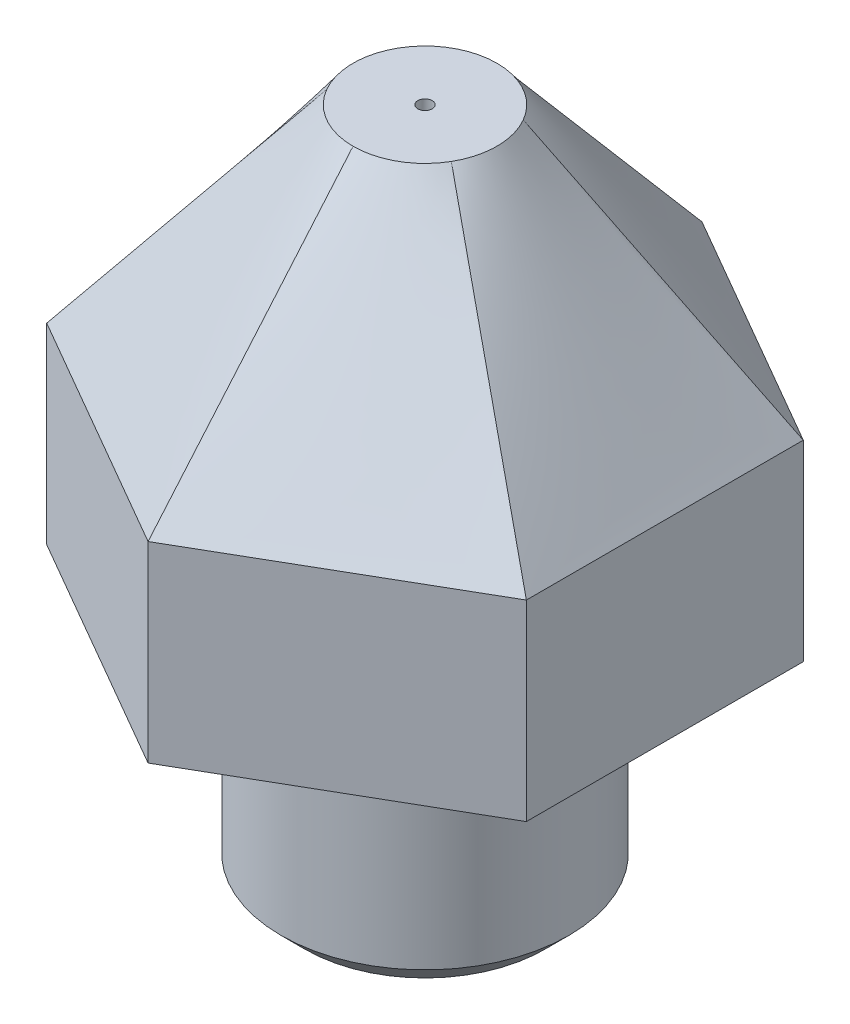
ISO-10303-21;
HEADER;
FILE_DESCRIPTION(('STEP AP214'),'2;1');
FILE_NAME('part.step','',(''),(''),'','','');
FILE_SCHEMA(('AUTOMOTIVE_DESIGN { 1 0 10303 214 1 1 1 1 }'));
ENDSEC;
DATA;
#1=APPLICATION_CONTEXT('core data for automotive mechanical design processes');
#2=APPLICATION_PROTOCOL_DEFINITION('international standard','automotive_design',2000,#1);
#3=PRODUCT_CONTEXT('',#1,'mechanical');
#4=PRODUCT('Part','Part','',(#3));
#5=PRODUCT_RELATED_PRODUCT_CATEGORY('part','',(#4));
#6=PRODUCT_DEFINITION_FORMATION('','',#4);
#7=PRODUCT_DEFINITION_CONTEXT('part definition',#1,'design');
#8=PRODUCT_DEFINITION('design','',#6,#7);
#9=PRODUCT_DEFINITION_SHAPE('','',#8);
#10=(LENGTH_UNIT() NAMED_UNIT(*) SI_UNIT(.MILLI.,.METRE.));
#11=(NAMED_UNIT(*) PLANE_ANGLE_UNIT() SI_UNIT($,.RADIAN.));
#12=(NAMED_UNIT(*) SI_UNIT($,.STERADIAN.) SOLID_ANGLE_UNIT());
#13=UNCERTAINTY_MEASURE_WITH_UNIT(LENGTH_MEASURE(1.E-05),#10,'distance_accuracy_value','');
#14=(GEOMETRIC_REPRESENTATION_CONTEXT(3) GLOBAL_UNCERTAINTY_ASSIGNED_CONTEXT((#13)) GLOBAL_UNIT_ASSIGNED_CONTEXT((#10,
#11,#12)) REPRESENTATION_CONTEXT('',''));
#15=CARTESIAN_POINT('',(0.,0.,0.));
#16=DIRECTION('',(0.,0.,1.));
#17=DIRECTION('',(1.,0.,0.));
#18=AXIS2_PLACEMENT_3D('',#15,#16,#17);
#19=CARTESIAN_POINT('',(0.,5.,0.));
#20=DIRECTION('',(0.,-1.,0.));
#21=DIRECTION('',(0.,0.,-1.));
#22=AXIS2_PLACEMENT_3D('',#19,#20,#21);
#23=CYLINDRICAL_SURFACE('',#22,3.);
#24=CARTESIAN_POINT('',(0.,0.500000000000001,0.));
#25=DIRECTION('',(0.,1.,0.));
#26=DIRECTION('',(0.,0.,1.));
#27=AXIS2_PLACEMENT_3D('',#24,#25,#26);
#28=CIRCLE('',#27,3.);
#29=CARTESIAN_POINT('',(0.,0.500000000000001,3.));
#30=VERTEX_POINT('',#29);
#31=EDGE_CURVE('E87',#30,#30,#28,.T.);
#32=ORIENTED_EDGE('',*,*,#31,.T.);
#33=EDGE_LOOP('',(#32));
#34=FACE_BOUND('',#33,.T.);
#35=CARTESIAN_POINT('',(0.,5.,0.));
#36=DIRECTION('',(0.,1.,0.));
#37=DIRECTION('',(0.,0.,1.));
#38=AXIS2_PLACEMENT_3D('',#35,#36,#37);
#39=CIRCLE('',#38,3.);
#40=CARTESIAN_POINT('',(0.,5.,3.));
#41=VERTEX_POINT('',#40);
#42=EDGE_CURVE('E237',#41,#41,#39,.T.);
#43=ORIENTED_EDGE('',*,*,#42,.F.);
#44=EDGE_LOOP('',(#43));
#45=FACE_BOUND('',#44,.T.);
#46=ADVANCED_FACE('F77',(#34,#45),#23,.T.);
#47=CARTESIAN_POINT('',(0.,0.,0.));
#48=DIRECTION('',(0.,1.,0.));
#49=DIRECTION('',(0.,0.,1.));
#50=AXIS2_PLACEMENT_3D('',#47,#48,#49);
#51=PLANE('',#50);
#52=CARTESIAN_POINT('',(0.,0.,0.));
#53=DIRECTION('',(0.,-1.,0.));
#54=DIRECTION('',(0.,0.,-1.));
#55=AXIS2_PLACEMENT_3D('',#52,#53,#54);
#56=CIRCLE('',#55,0.5);
#57=CARTESIAN_POINT('',(0.,0.,-0.5));
#58=VERTEX_POINT('',#57);
#59=EDGE_CURVE('E366',#58,#58,#56,.T.);
#60=ORIENTED_EDGE('',*,*,#59,.F.);
#61=EDGE_LOOP('',(#60));
#62=FACE_BOUND('',#61,.T.);
#63=CARTESIAN_POINT('',(0.,0.,0.));
#64=DIRECTION('',(0.,1.,0.));
#65=DIRECTION('',(0.,0.,1.));
#66=AXIS2_PLACEMENT_3D('',#63,#64,#65);
#67=CIRCLE('',#66,2.5);
#68=CARTESIAN_POINT('',(0.,0.,2.5));
#69=VERTEX_POINT('',#68);
#70=EDGE_CURVE('E12',#69,#69,#67,.F.);
#71=ORIENTED_EDGE('',*,*,#70,.T.);
#72=EDGE_LOOP('',(#71));
#73=FACE_BOUND('',#72,.T.);
#74=ADVANCED_FACE('F206',(#62,#73),#51,.F.);
#75=CARTESIAN_POINT('',(0.,5.,-5.77350269189626));
#76=DIRECTION('',(0.,1.,0.));
#77=DIRECTION('',(0.,0.,1.));
#78=AXIS2_PLACEMENT_3D('',#75,#76,#77);
#79=PLANE('',#78);
#80=DIRECTION('',(-0.866025403784439,0.,-0.5));
#81=VECTOR('',#80,1.);
#82=CARTESIAN_POINT('',(4.99999999999999,5.,-2.88675134594813));
#83=LINE('',#82,#81);
#84=CARTESIAN_POINT('',(4.99999999999999,5.,-2.88675134594813));
#85=VERTEX_POINT('',#84);
#86=CARTESIAN_POINT('',(0.,5.,-5.77350269189626));
#87=VERTEX_POINT('',#86);
#88=EDGE_CURVE('E266',#85,#87,#83,.T.);
#89=ORIENTED_EDGE('',*,*,#88,.F.);
#90=DIRECTION('',(0.,0.,-1.));
#91=VECTOR('',#90,1.);
#92=CARTESIAN_POINT('',(5.,5.,2.88675134594813));
#93=LINE('',#92,#91);
#94=CARTESIAN_POINT('',(5.,5.,2.88675134594813));
#95=VERTEX_POINT('',#94);
#96=EDGE_CURVE('E245',#95,#85,#93,.T.);
#97=ORIENTED_EDGE('',*,*,#96,.F.);
#98=DIRECTION('',(0.866025403784438,0.,-0.5));
#99=VECTOR('',#98,1.);
#100=CARTESIAN_POINT('',(0.,5.,5.77350269189626));
#101=LINE('',#100,#99);
#102=CARTESIAN_POINT('',(0.,5.,5.77350269189626));
#103=VERTEX_POINT('',#102);
#104=EDGE_CURVE('E433',#103,#95,#101,.T.);
#105=ORIENTED_EDGE('',*,*,#104,.F.);
#106=DIRECTION('',(0.866025403784439,0.,0.5));
#107=VECTOR('',#106,1.);
#108=CARTESIAN_POINT('',(-5.,5.,2.88675134594813));
#109=LINE('',#108,#107);
#110=CARTESIAN_POINT('',(-5.,5.,2.88675134594813));
#111=VERTEX_POINT('',#110);
#112=EDGE_CURVE('E432',#111,#103,#109,.T.);
#113=ORIENTED_EDGE('',*,*,#112,.F.);
#114=DIRECTION('',(0.,0.,1.));
#115=VECTOR('',#114,1.);
#116=CARTESIAN_POINT('',(-5.,5.,-2.88675134594813));
#117=LINE('',#116,#115);
#118=CARTESIAN_POINT('',(-5.,5.,-2.88675134594813));
#119=VERTEX_POINT('',#118);
#120=EDGE_CURVE('E124',#119,#111,#117,.T.);
#121=ORIENTED_EDGE('',*,*,#120,.F.);
#122=DIRECTION('',(-0.866025403784439,0.,0.5));
#123=VECTOR('',#122,1.);
#124=CARTESIAN_POINT('',(0.,5.,-5.77350269189626));
#125=LINE('',#124,#123);
#126=EDGE_CURVE('E425',#87,#119,#125,.T.);
#127=ORIENTED_EDGE('',*,*,#126,.F.);
#128=EDGE_LOOP('',(#89,#97,#105,#113,#121,#127));
#129=FACE_BOUND('',#128,.T.);
#130=ORIENTED_EDGE('',*,*,#42,.T.);
#131=EDGE_LOOP('',(#130));
#132=FACE_BOUND('',#131,.T.);
#133=ADVANCED_FACE('F197',(#129,#132),#79,.F.);
#134=CARTESIAN_POINT('',(4.99999999999999,9.,-2.88675134594813));
#135=DIRECTION('',(-0.5,0.,0.866025403784439));
#136=DIRECTION('',(0.866025403784439,0.,0.5));
#137=AXIS2_PLACEMENT_3D('',#134,#135,#136);
#138=PLANE('',#137);
#139=ORIENTED_EDGE('',*,*,#88,.T.);
#140=DIRECTION('',(0.,-1.,0.));
#141=VECTOR('',#140,1.);
#142=CARTESIAN_POINT('',(0.,9.,-5.77350269189626));
#143=LINE('',#142,#141);
#144=CARTESIAN_POINT('',(0.,9.,-5.77350269189626));
#145=VERTEX_POINT('',#144);
#146=EDGE_CURVE('E239',#145,#87,#143,.T.);
#147=ORIENTED_EDGE('',*,*,#146,.F.);
#148=DIRECTION('',(0.866025403784439,0.,0.5));
#149=VECTOR('',#148,1.);
#150=CARTESIAN_POINT('',(4.99999999999999,9.,-2.88675134594813));
#151=LINE('',#150,#149);
#152=CARTESIAN_POINT('',(4.99999999999999,9.,-2.88675134594813));
#153=VERTEX_POINT('',#152);
#154=EDGE_CURVE('E257',#153,#145,#151,.F.);
#155=ORIENTED_EDGE('',*,*,#154,.F.);
#156=DIRECTION('',(0.,-1.,0.));
#157=VECTOR('',#156,1.);
#158=CARTESIAN_POINT('',(4.99999999999999,9.,-2.88675134594813));
#159=LINE('',#158,#157);
#160=EDGE_CURVE('E96',#153,#85,#159,.T.);
#161=ORIENTED_EDGE('',*,*,#160,.T.);
#162=EDGE_LOOP('',(#139,#147,#155,#161));
#163=FACE_BOUND('',#162,.T.);
#164=ADVANCED_FACE('F205',(#163),#138,.F.);
#165=CARTESIAN_POINT('',(0.,9.,-5.77350269189626));
#166=DIRECTION('',(0.5,0.,0.866025403784439));
#167=DIRECTION('',(0.866025403784439,0.,-0.5));
#168=AXIS2_PLACEMENT_3D('',#165,#166,#167);
#169=PLANE('',#168);
#170=ORIENTED_EDGE('',*,*,#126,.T.);
#171=DIRECTION('',(0.,-1.,0.));
#172=VECTOR('',#171,1.);
#173=CARTESIAN_POINT('',(-5.,9.,-2.88675134594813));
#174=LINE('',#173,#172);
#175=CARTESIAN_POINT('',(-5.,9.,-2.88675134594813));
#176=VERTEX_POINT('',#175);
#177=EDGE_CURVE('E128',#176,#119,#174,.T.);
#178=ORIENTED_EDGE('',*,*,#177,.F.);
#179=DIRECTION('',(0.866025403784439,0.,-0.5));
#180=VECTOR('',#179,1.);
#181=CARTESIAN_POINT('',(0.,9.,-5.77350269189626));
#182=LINE('',#181,#180);
#183=EDGE_CURVE('E149',#145,#176,#182,.F.);
#184=ORIENTED_EDGE('',*,*,#183,.F.);
#185=ORIENTED_EDGE('',*,*,#146,.T.);
#186=EDGE_LOOP('',(#170,#178,#184,#185));
#187=FACE_BOUND('',#186,.T.);
#188=ADVANCED_FACE('F219',(#187),#169,.F.);
#189=CARTESIAN_POINT('',(-5.,9.,-2.88675134594813));
#190=DIRECTION('',(1.,0.,0.));
#191=DIRECTION('',(0.,0.,-1.));
#192=AXIS2_PLACEMENT_3D('',#189,#190,#191);
#193=PLANE('',#192);
#194=ORIENTED_EDGE('',*,*,#120,.T.);
#195=DIRECTION('',(0.,-1.,0.));
#196=VECTOR('',#195,1.);
#197=CARTESIAN_POINT('',(-5.,9.,2.88675134594813));
#198=LINE('',#197,#196);
#199=CARTESIAN_POINT('',(-5.,9.,2.88675134594813));
#200=VERTEX_POINT('',#199);
#201=EDGE_CURVE('E115',#200,#111,#198,.T.);
#202=ORIENTED_EDGE('',*,*,#201,.F.);
#203=DIRECTION('',(0.,0.,-1.));
#204=VECTOR('',#203,1.);
#205=CARTESIAN_POINT('',(-5.,9.,-2.88675134594813));
#206=LINE('',#205,#204);
#207=EDGE_CURVE('E120',#176,#200,#206,.F.);
#208=ORIENTED_EDGE('',*,*,#207,.F.);
#209=ORIENTED_EDGE('',*,*,#177,.T.);
#210=EDGE_LOOP('',(#194,#202,#208,#209));
#211=FACE_BOUND('',#210,.T.);
#212=ADVANCED_FACE('F117',(#211),#193,.F.);
#213=CARTESIAN_POINT('',(-5.,9.,2.88675134594813));
#214=DIRECTION('',(0.5,0.,-0.866025403784439));
#215=DIRECTION('',(-0.866025403784439,0.,-0.5));
#216=AXIS2_PLACEMENT_3D('',#213,#214,#215);
#217=PLANE('',#216);
#218=ORIENTED_EDGE('',*,*,#112,.T.);
#219=DIRECTION('',(0.,-1.,0.));
#220=VECTOR('',#219,1.);
#221=CARTESIAN_POINT('',(0.,9.,5.77350269189626));
#222=LINE('',#221,#220);
#223=CARTESIAN_POINT('',(0.,9.,5.77350269189626));
#224=VERTEX_POINT('',#223);
#225=EDGE_CURVE('E129',#224,#103,#222,.T.);
#226=ORIENTED_EDGE('',*,*,#225,.F.);
#227=DIRECTION('',(-0.866025403784439,0.,-0.5));
#228=VECTOR('',#227,1.);
#229=CARTESIAN_POINT('',(-5.,9.,2.88675134594813));
#230=LINE('',#229,#228);
#231=EDGE_CURVE('E132',#200,#224,#230,.F.);
#232=ORIENTED_EDGE('',*,*,#231,.F.);
#233=ORIENTED_EDGE('',*,*,#201,.T.);
#234=EDGE_LOOP('',(#218,#226,#232,#233));
#235=FACE_BOUND('',#234,.T.);
#236=ADVANCED_FACE('F133',(#235),#217,.F.);
#237=CARTESIAN_POINT('',(0.,9.,5.77350269189626));
#238=DIRECTION('',(-0.5,0.,-0.866025403784439));
#239=DIRECTION('',(-0.866025403784438,0.,0.5));
#240=AXIS2_PLACEMENT_3D('',#237,#238,#239);
#241=PLANE('',#240);
#242=ORIENTED_EDGE('',*,*,#104,.T.);
#243=DIRECTION('',(0.,-1.,0.));
#244=VECTOR('',#243,1.);
#245=CARTESIAN_POINT('',(5.,9.,2.88675134594813));
#246=LINE('',#245,#244);
#247=CARTESIAN_POINT('',(5.,9.,2.88675134594813));
#248=VERTEX_POINT('',#247);
#249=EDGE_CURVE('E248',#248,#95,#246,.T.);
#250=ORIENTED_EDGE('',*,*,#249,.F.);
#251=DIRECTION('',(-0.866025403784438,0.,0.5));
#252=VECTOR('',#251,1.);
#253=CARTESIAN_POINT('',(0.,9.,5.77350269189626));
#254=LINE('',#253,#252);
#255=EDGE_CURVE('E81',#224,#248,#254,.F.);
#256=ORIENTED_EDGE('',*,*,#255,.F.);
#257=ORIENTED_EDGE('',*,*,#225,.T.);
#258=EDGE_LOOP('',(#242,#250,#256,#257));
#259=FACE_BOUND('',#258,.T.);
#260=ADVANCED_FACE('F211',(#259),#241,.F.);
#261=CARTESIAN_POINT('',(5.,9.,2.88675134594813));
#262=DIRECTION('',(-1.,0.,0.));
#263=DIRECTION('',(0.,0.,1.));
#264=AXIS2_PLACEMENT_3D('',#261,#262,#263);
#265=PLANE('',#264);
#266=ORIENTED_EDGE('',*,*,#96,.T.);
#267=ORIENTED_EDGE('',*,*,#160,.F.);
#268=DIRECTION('',(0.,0.,1.));
#269=VECTOR('',#268,1.);
#270=CARTESIAN_POINT('',(5.,9.,2.88675134594813));
#271=LINE('',#270,#269);
#272=EDGE_CURVE('E254',#248,#153,#271,.F.);
#273=ORIENTED_EDGE('',*,*,#272,.F.);
#274=ORIENTED_EDGE('',*,*,#249,.T.);
#275=EDGE_LOOP('',(#266,#267,#273,#274));
#276=FACE_BOUND('',#275,.T.);
#277=ADVANCED_FACE('F208',(#276),#265,.F.);
#278=CARTESIAN_POINT('',(0.,0.500000000000001,0.));
#279=DIRECTION('',(0.,1.,0.));
#280=DIRECTION('',(0.,0.,1.));
#281=AXIS2_PLACEMENT_3D('',#278,#279,#280);
#282=CONICAL_SURFACE('',#281,3.,0.78539816339745);
#283=ORIENTED_EDGE('',*,*,#70,.F.);
#284=EDGE_LOOP('',(#283));
#285=FACE_BOUND('',#284,.T.);
#286=ORIENTED_EDGE('',*,*,#31,.F.);
#287=EDGE_LOOP('',(#286));
#288=FACE_BOUND('',#287,.T.);
#289=ADVANCED_FACE('F79',(#285,#288),#282,.T.);
#290=CARTESIAN_POINT('',(0.,14.,0.));
#291=DIRECTION('',(0.,1.,0.));
#292=DIRECTION('',(0.,0.,1.));
#293=AXIS2_PLACEMENT_3D('',#290,#291,#292);
#294=PLANE('',#293);
#295=CARTESIAN_POINT('',(0.,14.,0.));
#296=DIRECTION('',(0.,1.,0.));
#297=DIRECTION('',(0.,0.,1.));
#298=AXIS2_PLACEMENT_3D('',#295,#296,#297);
#299=CIRCLE('',#298,0.15);
#300=CARTESIAN_POINT('',(0.,14.,-0.15));
#301=VERTEX_POINT('',#300);
#302=EDGE_CURVE('E571',#301,#301,#299,.T.);
#303=ORIENTED_EDGE('',*,*,#302,.F.);
#304=EDGE_LOOP('',(#303));
#305=FACE_BOUND('',#304,.T.);
#306=CARTESIAN_POINT('',(0.,14.,0.));
#307=DIRECTION('',(0.,1.,0.));
#308=DIRECTION('',(0.,0.,1.));
#309=AXIS2_PLACEMENT_3D('',#306,#307,#308);
#310=CIRCLE('',#309,1.5);
#311=CARTESIAN_POINT('',(1.29903810567666,14.,-0.750000000000002));
#312=VERTEX_POINT('',#311);
#313=CARTESIAN_POINT('',(0.,14.,-1.5));
#314=VERTEX_POINT('',#313);
#315=EDGE_CURVE('E274',#312,#314,#310,.T.);
#316=ORIENTED_EDGE('',*,*,#315,.T.);
#317=CARTESIAN_POINT('',(-1.29903810567666,14.,-0.750000000000001));
#318=VERTEX_POINT('',#317);
#319=EDGE_CURVE('E173',#314,#318,#310,.T.);
#320=ORIENTED_EDGE('',*,*,#319,.T.);
#321=CARTESIAN_POINT('',(-1.29903810567666,14.,0.75));
#322=VERTEX_POINT('',#321);
#323=EDGE_CURVE('E352',#318,#322,#310,.T.);
#324=ORIENTED_EDGE('',*,*,#323,.T.);
#325=CARTESIAN_POINT('',(0.,14.,1.5));
#326=VERTEX_POINT('',#325);
#327=EDGE_CURVE('E154',#322,#326,#310,.T.);
#328=ORIENTED_EDGE('',*,*,#327,.T.);
#329=CARTESIAN_POINT('',(1.29903810567666,14.,0.750000000000001));
#330=VERTEX_POINT('',#329);
#331=EDGE_CURVE('E341',#326,#330,#310,.T.);
#332=ORIENTED_EDGE('',*,*,#331,.T.);
#333=EDGE_CURVE('E282',#330,#312,#310,.T.);
#334=ORIENTED_EDGE('',*,*,#333,.T.);
#335=EDGE_LOOP('',(#316,#320,#324,#328,#332,#334));
#336=FACE_BOUND('',#335,.T.);
#337=ADVANCED_FACE('F192',(#305,#336),#294,.T.);
#338=CARTESIAN_POINT('',(1.29903810567666,14.,-0.750000000000002));
#339=CARTESIAN_POINT('',(4.99999999999999,9.,-2.88675134594813));
#340=CARTESIAN_POINT('',(1.42403810567666,14.,-0.533493649053892));
#341=CARTESIAN_POINT('',(4.99999999999999,9.,-1.92450089729876));
#342=CARTESIAN_POINT('',(1.5,14.,-0.267949192431124));
#343=CARTESIAN_POINT('',(4.99999999999999,9.,-0.962250448649382));
#344=CARTESIAN_POINT('',(1.5,14.,0.267949192431123));
#345=CARTESIAN_POINT('',(4.99999999999999,9.,0.962250448649372));
#346=CARTESIAN_POINT('',(1.42403810567666,14.,0.533493649053891));
#347=CARTESIAN_POINT('',(4.99999999999999,9.,1.92450089729875));
#348=CARTESIAN_POINT('',(1.29903810567666,14.,0.750000000000001));
#349=CARTESIAN_POINT('',(5.,9.,2.88675134594813));
#350=B_SPLINE_SURFACE_WITH_KNOTS('',3,1,((#338,#339),(#340,#341),(#342,#343),(#344,#345),(#346,
#347),(#348,#349)),.UNSPECIFIED.,.F.,.F.,.F.,(4,2,4),(2,2),(0.,0.5,1.),(0.,1.),.UNSPECIFIED.);
#351=DIRECTION('',(0.56267442376232,-0.760173219596464,0.324860230025293));
#352=VECTOR('',#351,1.);
#353=CARTESIAN_POINT('',(3.14951905283833,11.5,1.81837567297406));
#354=LINE('',#353,#352);
#355=EDGE_CURVE('E279',#330,#248,#354,.T.);
#356=DIRECTION('',(-0.56267442376232,0.760173219596464,0.324860230025294));
#357=VECTOR('',#356,1.);
#358=CARTESIAN_POINT('',(3.14951905283833,11.5,-1.81837567297407));
#359=LINE('',#358,#357);
#360=EDGE_CURVE('E158',#153,#312,#359,.T.);
#361=ORIENTED_EDGE('',*,*,#333,.F.);
#362=ORIENTED_EDGE('',*,*,#355,.T.);
#363=ORIENTED_EDGE('',*,*,#272,.T.);
#364=ORIENTED_EDGE('',*,*,#360,.T.);
#365=EDGE_LOOP('',(#361,#362,#363,#364));
#366=FACE_BOUND('',#365,.T.);
#367=ADVANCED_FACE('F402',(#366),#350,.T.);
#368=CARTESIAN_POINT('',(1.29903810567666,14.,0.750000000000001));
#369=CARTESIAN_POINT('',(4.99999999999999,9.,2.88675134594813));
#370=CARTESIAN_POINT('',(1.17403810567666,14.,0.96650635094611));
#371=CARTESIAN_POINT('',(4.16666666666666,9.,3.36787657027282));
#372=CARTESIAN_POINT('',(0.982050807568878,14.,1.1650635094611));
#373=CARTESIAN_POINT('',(3.33333333333333,9.,3.84900179459751));
#374=CARTESIAN_POINT('',(0.517949192431123,14.,1.43301270189222));
#375=CARTESIAN_POINT('',(1.66666666666666,9.,4.81125224324688));
#376=CARTESIAN_POINT('',(0.250000000000001,14.,1.5));
#377=CARTESIAN_POINT('',(0.833333333333333,9.,5.29237746757157));
#378=CARTESIAN_POINT('',(0.,14.,1.5));
#379=CARTESIAN_POINT('',(0.,9.,5.77350269189626));
#380=B_SPLINE_SURFACE_WITH_KNOTS('',3,1,((#368,#369),(#370,#371),(#372,#373),(#374,#375),(#376,
#377),(#378,#379)),.UNSPECIFIED.,.F.,.F.,.F.,(4,2,4),(2,2),(0.,0.5,1.),(0.,1.),.UNSPECIFIED.);
#381=DIRECTION('',(0.,-0.760173219596464,0.649720460050586));
#382=VECTOR('',#381,1.);
#383=CARTESIAN_POINT('',(0.,11.5,3.63675134594813));
#384=LINE('',#383,#382);
#385=EDGE_CURVE('E156',#326,#224,#384,.T.);
#386=ORIENTED_EDGE('',*,*,#331,.F.);
#387=ORIENTED_EDGE('',*,*,#385,.T.);
#388=ORIENTED_EDGE('',*,*,#255,.T.);
#389=ORIENTED_EDGE('',*,*,#355,.F.);
#390=EDGE_LOOP('',(#386,#387,#388,#389));
#391=FACE_BOUND('',#390,.T.);
#392=ADVANCED_FACE('F316',(#391),#380,.T.);
#393=CARTESIAN_POINT('',(0.,14.,-1.5));
#394=CARTESIAN_POINT('',(0.,9.,-5.77350269189626));
#395=CARTESIAN_POINT('',(0.25,14.,-1.5));
#396=CARTESIAN_POINT('',(0.833333333333333,9.,-5.29237746757157));
#397=CARTESIAN_POINT('',(0.517949192431123,14.,-1.43301270189222));
#398=CARTESIAN_POINT('',(1.66666666666667,9.,-4.81125224324688));
#399=CARTESIAN_POINT('',(0.982050807568877,14.,-1.1650635094611));
#400=CARTESIAN_POINT('',(3.33333333333333,9.,-3.84900179459751));
#401=CARTESIAN_POINT('',(1.17403810567666,14.,-0.966506350946111));
#402=CARTESIAN_POINT('',(4.16666666666666,9.,-3.36787657027282));
#403=CARTESIAN_POINT('',(1.29903810567666,14.,-0.750000000000002));
#404=CARTESIAN_POINT('',(4.99999999999999,9.,-2.88675134594813));
#405=B_SPLINE_SURFACE_WITH_KNOTS('',3,1,((#393,#394),(#395,#396),(#397,#398),(#399,#400),(#401,
#402),(#403,#404)),.UNSPECIFIED.,.F.,.F.,.F.,(4,2,4),(2,2),(0.,0.5,1.),(0.,1.),.UNSPECIFIED.);
#406=DIRECTION('',(0.,-0.760173219596464,-0.649720460050587));
#407=VECTOR('',#406,1.);
#408=CARTESIAN_POINT('',(0.,11.5,-3.63675134594813));
#409=LINE('',#408,#407);
#410=EDGE_CURVE('E160',#314,#145,#409,.T.);
#411=ORIENTED_EDGE('',*,*,#315,.F.);
#412=ORIENTED_EDGE('',*,*,#360,.F.);
#413=ORIENTED_EDGE('',*,*,#154,.T.);
#414=ORIENTED_EDGE('',*,*,#410,.F.);
#415=EDGE_LOOP('',(#411,#412,#413,#414));
#416=FACE_BOUND('',#415,.T.);
#417=ADVANCED_FACE('F270',(#416),#405,.T.);
#418=CARTESIAN_POINT('',(0.,14.,1.5));
#419=CARTESIAN_POINT('',(0.,9.,5.77350269189626));
#420=CARTESIAN_POINT('',(-0.249999999999999,14.,1.5));
#421=CARTESIAN_POINT('',(-0.833333333333333,9.,5.29237746757157));
#422=CARTESIAN_POINT('',(-0.517949192431122,14.,1.43301270189222));
#423=CARTESIAN_POINT('',(-1.66666666666667,9.,4.81125224324688));
#424=CARTESIAN_POINT('',(-0.982050807568877,14.,1.1650635094611));
#425=CARTESIAN_POINT('',(-3.33333333333333,9.,3.8490017945975));
#426=CARTESIAN_POINT('',(-1.17403810567666,14.,0.96650635094611));
#427=CARTESIAN_POINT('',(-4.16666666666667,9.,3.36787657027281));
#428=CARTESIAN_POINT('',(-1.29903810567666,14.,0.75));
#429=CARTESIAN_POINT('',(-5.,9.,2.88675134594813));
#430=B_SPLINE_SURFACE_WITH_KNOTS('',3,1,((#418,#419),(#420,#421),(#422,#423),(#424,#425),(#426,
#427),(#428,#429)),.UNSPECIFIED.,.F.,.F.,.F.,(4,2,4),(2,2),(0.,0.5,1.),(0.,1.),.UNSPECIFIED.);
#431=DIRECTION('',(-0.56267442376232,-0.760173219596464,0.324860230025293));
#432=VECTOR('',#431,1.);
#433=CARTESIAN_POINT('',(-3.14951905283833,11.5,1.81837567297406));
#434=LINE('',#433,#432);
#435=EDGE_CURVE('E146',#322,#200,#434,.T.);
#436=ORIENTED_EDGE('',*,*,#327,.F.);
#437=ORIENTED_EDGE('',*,*,#435,.T.);
#438=ORIENTED_EDGE('',*,*,#231,.T.);
#439=ORIENTED_EDGE('',*,*,#385,.F.);
#440=EDGE_LOOP('',(#436,#437,#438,#439));
#441=FACE_BOUND('',#440,.T.);
#442=ADVANCED_FACE('F152',(#441),#430,.T.);
#443=CARTESIAN_POINT('',(-1.29903810567666,14.,0.75));
#444=CARTESIAN_POINT('',(-5.,9.,2.88675134594813));
#445=CARTESIAN_POINT('',(-1.42403810567666,14.,0.533493649053891));
#446=CARTESIAN_POINT('',(-5.,9.,1.92450089729875));
#447=CARTESIAN_POINT('',(-1.5,14.,0.267949192431122));
#448=CARTESIAN_POINT('',(-5.,9.,0.962250448649377));
#449=CARTESIAN_POINT('',(-1.5,14.,-0.267949192431123));
#450=CARTESIAN_POINT('',(-5.,9.,-0.962250448649376));
#451=CARTESIAN_POINT('',(-1.42403810567666,14.,-0.533493649053891));
#452=CARTESIAN_POINT('',(-5.,9.,-1.92450089729875));
#453=CARTESIAN_POINT('',(-1.29903810567666,14.,-0.750000000000001));
#454=CARTESIAN_POINT('',(-5.,9.,-2.88675134594813));
#455=B_SPLINE_SURFACE_WITH_KNOTS('',3,1,((#443,#444),(#445,#446),(#447,#448),(#449,#450),(#451,
#452),(#453,#454)),.UNSPECIFIED.,.F.,.F.,.F.,(4,2,4),(2,2),(0.,0.5,1.),(0.,1.),.UNSPECIFIED.);
#456=DIRECTION('',(-0.562674423762321,-0.760173219596464,-0.324860230025293));
#457=VECTOR('',#456,1.);
#458=CARTESIAN_POINT('',(-3.14951905283833,11.5,-1.81837567297407));
#459=LINE('',#458,#457);
#460=EDGE_CURVE('E148',#318,#176,#459,.T.);
#461=ORIENTED_EDGE('',*,*,#323,.F.);
#462=ORIENTED_EDGE('',*,*,#460,.T.);
#463=ORIENTED_EDGE('',*,*,#207,.T.);
#464=ORIENTED_EDGE('',*,*,#435,.F.);
#465=EDGE_LOOP('',(#461,#462,#463,#464));
#466=FACE_BOUND('',#465,.T.);
#467=ADVANCED_FACE('F144',(#466),#455,.T.);
#468=CARTESIAN_POINT('',(-1.29903810567666,14.,-0.750000000000001));
#469=CARTESIAN_POINT('',(-5.,9.,-2.88675134594813));
#470=CARTESIAN_POINT('',(-1.17403810567666,14.,-0.96650635094611));
#471=CARTESIAN_POINT('',(-4.16666666666667,9.,-3.36787657027282));
#472=CARTESIAN_POINT('',(-0.982050807568877,14.,-1.1650635094611));
#473=CARTESIAN_POINT('',(-3.33333333333333,9.,-3.84900179459751));
#474=CARTESIAN_POINT('',(-0.517949192431122,14.,-1.43301270189222));
#475=CARTESIAN_POINT('',(-1.66666666666667,9.,-4.81125224324688));
#476=CARTESIAN_POINT('',(-0.25,14.,-1.5));
#477=CARTESIAN_POINT('',(-0.833333333333334,9.,-5.29237746757157));
#478=CARTESIAN_POINT('',(0.,14.,-1.5));
#479=CARTESIAN_POINT('',(0.,9.,-5.77350269189626));
#480=B_SPLINE_SURFACE_WITH_KNOTS('',3,1,((#468,#469),(#470,#471),(#472,#473),(#474,#475),(#476,
#477),(#478,#479)),.UNSPECIFIED.,.F.,.F.,.F.,(4,2,4),(2,2),(0.,0.5,1.),(0.,1.),.UNSPECIFIED.);
#481=ORIENTED_EDGE('',*,*,#319,.F.);
#482=ORIENTED_EDGE('',*,*,#410,.T.);
#483=ORIENTED_EDGE('',*,*,#183,.T.);
#484=ORIENTED_EDGE('',*,*,#460,.F.);
#485=EDGE_LOOP('',(#481,#482,#483,#484));
#486=FACE_BOUND('',#485,.T.);
#487=ADVANCED_FACE('F179',(#486),#480,.T.);
#488=CARTESIAN_POINT('',(0.,14.,0.));
#489=DIRECTION('',(0.,-1.,0.));
#490=DIRECTION('',(0.,0.,-1.));
#491=AXIS2_PLACEMENT_3D('',#488,#489,#490);
#492=CONICAL_SURFACE('',#491,0.15,0.0249947936189201);
#493=CARTESIAN_POINT('',(0.,14.,-0.15));
#494=CARTESIAN_POINT('',(0.,13.8541666666667,-0.153645833333333));
#495=CARTESIAN_POINT('',(0.,13.7083333333333,-0.157291666666667));
#496=CARTESIAN_POINT('',(0.,13.4166666666667,-0.164583333333333));
#497=CARTESIAN_POINT('',(0.,13.2708333333333,-0.168229166666667));
#498=CARTESIAN_POINT('',(0.,12.9791666666667,-0.175520833333333));
#499=CARTESIAN_POINT('',(0.,12.8333333333333,-0.179166666666667));
#500=CARTESIAN_POINT('',(0.,12.5416666666667,-0.186458333333333));
#501=CARTESIAN_POINT('',(0.,12.3958333333333,-0.190104166666667));
#502=CARTESIAN_POINT('',(0.,12.1041666666667,-0.197395833333333));
#503=CARTESIAN_POINT('',(0.,11.9583333333333,-0.201041666666667));
#504=CARTESIAN_POINT('',(0.,11.6666666666667,-0.208333333333333));
#505=CARTESIAN_POINT('',(0.,11.5208333333333,-0.211979166666667));
#506=CARTESIAN_POINT('',(0.,11.2291666666667,-0.219270833333333));
#507=CARTESIAN_POINT('',(0.,11.0833333333333,-0.222916666666667));
#508=CARTESIAN_POINT('',(0.,10.7916666666667,-0.230208333333333));
#509=CARTESIAN_POINT('',(0.,10.6458333333333,-0.233854166666667));
#510=CARTESIAN_POINT('',(0.,10.3541666666667,-0.241145833333333));
#511=CARTESIAN_POINT('',(0.,10.2083333333333,-0.244791666666667));
#512=CARTESIAN_POINT('',(0.,9.91666666666667,-0.252083333333333));
#513=CARTESIAN_POINT('',(0.,9.77083333333333,-0.255729166666667));
#514=CARTESIAN_POINT('',(0.,9.47916666666667,-0.263020833333333));
#515=CARTESIAN_POINT('',(0.,9.33333333333333,-0.266666666666666));
#516=CARTESIAN_POINT('',(0.,9.04166666666667,-0.273958333333333));
#517=CARTESIAN_POINT('',(0.,8.89583333333333,-0.277604166666666));
#518=CARTESIAN_POINT('',(0.,8.60416666666667,-0.284895833333333));
#519=CARTESIAN_POINT('',(0.,8.45833333333333,-0.288541666666666));
#520=CARTESIAN_POINT('',(0.,8.16666666666667,-0.295833333333333));
#521=CARTESIAN_POINT('',(0.,8.02083333333333,-0.299479166666666));
#522=CARTESIAN_POINT('',(0.,7.72916666666667,-0.306770833333333));
#523=CARTESIAN_POINT('',(0.,7.58333333333333,-0.310416666666666));
#524=CARTESIAN_POINT('',(0.,7.29166666666667,-0.317708333333333));
#525=CARTESIAN_POINT('',(0.,7.14583333333333,-0.321354166666666));
#526=CARTESIAN_POINT('',(0.,6.85416666666667,-0.328645833333333));
#527=CARTESIAN_POINT('',(0.,6.70833333333333,-0.332291666666666));
#528=CARTESIAN_POINT('',(0.,6.41666666666667,-0.339583333333333));
#529=CARTESIAN_POINT('',(0.,6.27083333333333,-0.343229166666666));
#530=CARTESIAN_POINT('',(0.,5.97916666666667,-0.350520833333333));
#531=CARTESIAN_POINT('',(0.,5.83333333333333,-0.354166666666666));
#532=CARTESIAN_POINT('',(0.,5.54166666666667,-0.361458333333333));
#533=CARTESIAN_POINT('',(0.,5.39583333333333,-0.365104166666666));
#534=CARTESIAN_POINT('',(0.,5.10416666666667,-0.372395833333333));
#535=CARTESIAN_POINT('',(0.,4.95833333333333,-0.376041666666666));
#536=CARTESIAN_POINT('',(0.,4.66666666666667,-0.383333333333333));
#537=CARTESIAN_POINT('',(0.,4.52083333333333,-0.386979166666666));
#538=CARTESIAN_POINT('',(0.,4.22916666666667,-0.394270833333333));
#539=CARTESIAN_POINT('',(0.,4.08333333333333,-0.397916666666666));
#540=CARTESIAN_POINT('',(0.,3.79166666666667,-0.405208333333333));
#541=CARTESIAN_POINT('',(0.,3.64583333333333,-0.408854166666666));
#542=CARTESIAN_POINT('',(0.,3.35416666666667,-0.416145833333333));
#543=CARTESIAN_POINT('',(0.,3.20833333333333,-0.419791666666666));
#544=CARTESIAN_POINT('',(0.,2.91666666666667,-0.427083333333333));
#545=CARTESIAN_POINT('',(0.,2.77083333333333,-0.430729166666666));
#546=CARTESIAN_POINT('',(0.,2.47916666666667,-0.438020833333333));
#547=CARTESIAN_POINT('',(0.,2.33333333333333,-0.441666666666666));
#548=CARTESIAN_POINT('',(0.,2.04166666666667,-0.448958333333333));
#549=CARTESIAN_POINT('',(0.,1.89583333333333,-0.452604166666666));
#550=CARTESIAN_POINT('',(0.,1.60416666666667,-0.459895833333333));
#551=CARTESIAN_POINT('',(0.,1.45833333333333,-0.463541666666666));
#552=CARTESIAN_POINT('',(0.,1.16666666666667,-0.470833333333333));
#553=CARTESIAN_POINT('',(0.,1.02083333333333,-0.474479166666666));
#554=CARTESIAN_POINT('',(0.,0.729166666666667,-0.481770833333333));
#555=CARTESIAN_POINT('',(0.,0.583333333333334,-0.485416666666666));
#556=CARTESIAN_POINT('',(0.,0.291666666666667,-0.492708333333333));
#557=CARTESIAN_POINT('',(0.,0.145833333333334,-0.496354166666666));
#558=CARTESIAN_POINT('',(0.,0.,-0.5));
#559=B_SPLINE_CURVE_WITH_KNOTS('',3,(#493,#494,#495,#496,#497,#498,#499,#500,#501,#502,#503,
#504,#505,#506,#507,#508,#509,#510,#511,#512,#513,#514,#515,#516,#517,#518,#519,#520,#521,#522,
#523,#524,#525,#526,#527,#528,#529,#530,#531,#532,#533,#534,#535,#536,#537,#538,#539,#540,#541,
#542,#543,#544,#545,#546,#547,#548,#549,#550,#551,#552,#553,#554,#555,#556,#557,#558),
.UNSPECIFIED.,.F.,.F.,(4,2,2,2,2,2,2,2,2,2,2,2,2,2,2,2,2,2,2,2,2,2,2,2,2,2,2,2,2,2,2,2,4),(0.,
0.437636697394369,0.875273394788738,1.31291009218311,1.75054678957748,2.18818348697184,
2.62582018436621,3.06345688176058,3.50109357915495,3.93873027654932,4.37636697394368,
4.81400367133805,5.25164036873242,5.68927706612679,6.12691376352116,6.56455046091553,
7.0021871583099,7.43982385570427,7.87746055309863,8.315097250493,8.75273394788737,
9.19037064528174,9.62800734267611,10.0656440400705,10.5032807374649,10.9409174348592,
11.3785541322536,11.816190829648,12.2538275270423,12.6914642244367,13.1291009218311,
13.5667376192254,14.0043743166198),.UNSPECIFIED.);
#560=EDGE_CURVE('BSEAM191',#301,#58,#559,.T.);
#561=ORIENTED_EDGE('',*,*,#302,.T.);
#562=ORIENTED_EDGE('',*,*,#59,.T.);
#563=ORIENTED_EDGE('',*,*,#560,.T.);
#564=ORIENTED_EDGE('',*,*,#560,.F.);
#565=EDGE_LOOP('',(#561,#563,#562,#564));
#566=FACE_BOUND('',#565,.T.);
#567=ADVANCED_FACE('F191',(#566),#492,.F.);
#568=CLOSED_SHELL('',(#46,#74,#133,#164,#188,#212,#236,#260,#277,#289,#337,#367,#392,#417,#442,
#467,#487,#567));
#569=MANIFOLD_SOLID_BREP('B2',#568);
#570=ADVANCED_BREP_SHAPE_REPRESENTATION('',(#18,#569),#14);
#571=SHAPE_DEFINITION_REPRESENTATION(#9,#570);
ENDSEC;
END-ISO-10303-21;
